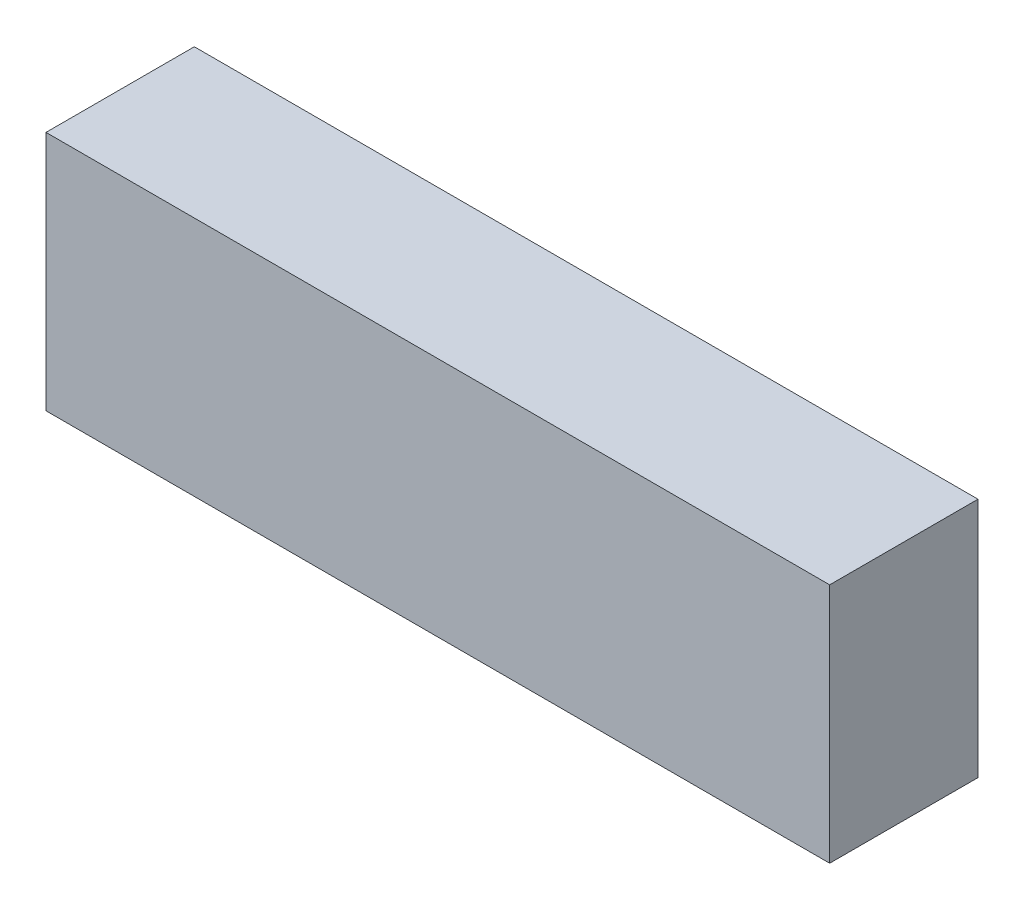
ISO-10303-21;
HEADER;
FILE_DESCRIPTION(('STEP AP214'),'2;1');
FILE_NAME('part.step','',(''),(''),'','','');
FILE_SCHEMA(('AUTOMOTIVE_DESIGN { 1 0 10303 214 1 1 1 1 }'));
ENDSEC;
DATA;
#1=APPLICATION_CONTEXT('core data for automotive mechanical design processes');
#2=APPLICATION_PROTOCOL_DEFINITION('international standard','automotive_design',2000,#1);
#3=PRODUCT_CONTEXT('',#1,'mechanical');
#4=PRODUCT('Part','Part','',(#3));
#5=PRODUCT_RELATED_PRODUCT_CATEGORY('part','',(#4));
#6=PRODUCT_DEFINITION_FORMATION('','',#4);
#7=PRODUCT_DEFINITION_CONTEXT('part definition',#1,'design');
#8=PRODUCT_DEFINITION('design','',#6,#7);
#9=PRODUCT_DEFINITION_SHAPE('','',#8);
#10=(LENGTH_UNIT() NAMED_UNIT(*) SI_UNIT(.MILLI.,.METRE.));
#11=(NAMED_UNIT(*) PLANE_ANGLE_UNIT() SI_UNIT($,.RADIAN.));
#12=(NAMED_UNIT(*) SI_UNIT($,.STERADIAN.) SOLID_ANGLE_UNIT());
#13=UNCERTAINTY_MEASURE_WITH_UNIT(LENGTH_MEASURE(1.E-05),#10,'distance_accuracy_value','');
#14=(GEOMETRIC_REPRESENTATION_CONTEXT(3) GLOBAL_UNCERTAINTY_ASSIGNED_CONTEXT((#13)) GLOBAL_UNIT_ASSIGNED_CONTEXT((#10,
#11,#12)) REPRESENTATION_CONTEXT('',''));
#15=CARTESIAN_POINT('',(0.,0.,0.));
#16=DIRECTION('',(0.,0.,1.));
#17=DIRECTION('',(1.,0.,0.));
#18=AXIS2_PLACEMENT_3D('',#15,#16,#17);
#19=CARTESIAN_POINT('',(-2.6416,-0.762,1.));
#20=DIRECTION('',(1.,0.,0.));
#21=DIRECTION('',(0.,0.,-1.));
#22=AXIS2_PLACEMENT_3D('',#19,#20,#21);
#23=PLANE('',#22);
#24=DIRECTION('',(0.,-1.,0.));
#25=VECTOR('',#24,1.);
#26=CARTESIAN_POINT('',(-2.6416,-0.762,0.));
#27=LINE('',#26,#25);
#28=CARTESIAN_POINT('',(-2.6416,0.8636,0.));
#29=VERTEX_POINT('',#28);
#30=CARTESIAN_POINT('',(-2.6416,-0.762,0.));
#31=VERTEX_POINT('',#30);
#32=EDGE_CURVE('E95',#29,#31,#27,.T.);
#33=ORIENTED_EDGE('',*,*,#32,.T.);
#34=DIRECTION('',(0.,0.,-1.));
#35=VECTOR('',#34,1.);
#36=CARTESIAN_POINT('',(-2.6416,-0.762,1.));
#37=LINE('',#36,#35);
#38=CARTESIAN_POINT('',(-2.6416,-0.762,1.));
#39=VERTEX_POINT('',#38);
#40=EDGE_CURVE('E11',#39,#31,#37,.T.);
#41=ORIENTED_EDGE('',*,*,#40,.F.);
#42=DIRECTION('',(0.,-1.,0.));
#43=VECTOR('',#42,1.);
#44=CARTESIAN_POINT('',(-2.6416,-0.762,1.));
#45=LINE('',#44,#43);
#46=CARTESIAN_POINT('',(-2.6416,0.8636,1.));
#47=VERTEX_POINT('',#46);
#48=EDGE_CURVE('E83',#47,#39,#45,.T.);
#49=ORIENTED_EDGE('',*,*,#48,.F.);
#50=DIRECTION('',(0.,0.,-1.));
#51=VECTOR('',#50,1.);
#52=CARTESIAN_POINT('',(-2.6416,0.8636,1.));
#53=LINE('',#52,#51);
#54=EDGE_CURVE('E91',#47,#29,#53,.T.);
#55=ORIENTED_EDGE('',*,*,#54,.T.);
#56=EDGE_LOOP('',(#33,#41,#49,#55));
#57=FACE_BOUND('',#56,.T.);
#58=ADVANCED_FACE('F32',(#57),#23,.F.);
#59=CARTESIAN_POINT('',(2.6416,-0.762,1.));
#60=DIRECTION('',(0.,1.,0.));
#61=DIRECTION('',(0.,0.,1.));
#62=AXIS2_PLACEMENT_3D('',#59,#60,#61);
#63=PLANE('',#62);
#64=DIRECTION('',(1.,0.,0.));
#65=VECTOR('',#64,1.);
#66=CARTESIAN_POINT('',(2.6416,-0.762,0.));
#67=LINE('',#66,#65);
#68=CARTESIAN_POINT('',(2.6416,-0.762,0.));
#69=VERTEX_POINT('',#68);
#70=EDGE_CURVE('E87',#31,#69,#67,.T.);
#71=ORIENTED_EDGE('',*,*,#70,.T.);
#72=DIRECTION('',(0.,0.,-1.));
#73=VECTOR('',#72,1.);
#74=CARTESIAN_POINT('',(2.6416,-0.762,1.));
#75=LINE('',#74,#73);
#76=CARTESIAN_POINT('',(2.6416,-0.762,1.));
#77=VERTEX_POINT('',#76);
#78=EDGE_CURVE('E40',#77,#69,#75,.T.);
#79=ORIENTED_EDGE('',*,*,#78,.F.);
#80=DIRECTION('',(1.,0.,0.));
#81=VECTOR('',#80,1.);
#82=CARTESIAN_POINT('',(2.6416,-0.762,1.));
#83=LINE('',#82,#81);
#84=EDGE_CURVE('E78',#39,#77,#83,.T.);
#85=ORIENTED_EDGE('',*,*,#84,.F.);
#86=ORIENTED_EDGE('',*,*,#40,.T.);
#87=EDGE_LOOP('',(#71,#79,#85,#86));
#88=FACE_BOUND('',#87,.T.);
#89=ADVANCED_FACE('F86',(#88),#63,.F.);
#90=CARTESIAN_POINT('',(2.6416,0.8636,1.));
#91=DIRECTION('',(-1.,0.,0.));
#92=DIRECTION('',(0.,0.,1.));
#93=AXIS2_PLACEMENT_3D('',#90,#91,#92);
#94=PLANE('',#93);
#95=DIRECTION('',(0.,1.,0.));
#96=VECTOR('',#95,1.);
#97=CARTESIAN_POINT('',(2.6416,0.8636,0.));
#98=LINE('',#97,#96);
#99=CARTESIAN_POINT('',(2.6416,0.8636,0.));
#100=VERTEX_POINT('',#99);
#101=EDGE_CURVE('E65',#69,#100,#98,.T.);
#102=ORIENTED_EDGE('',*,*,#101,.T.);
#103=DIRECTION('',(0.,0.,-1.));
#104=VECTOR('',#103,1.);
#105=CARTESIAN_POINT('',(2.6416,0.8636,1.));
#106=LINE('',#105,#104);
#107=CARTESIAN_POINT('',(2.6416,0.8636,1.));
#108=VERTEX_POINT('',#107);
#109=EDGE_CURVE('E88',#108,#100,#106,.T.);
#110=ORIENTED_EDGE('',*,*,#109,.F.);
#111=DIRECTION('',(0.,1.,0.));
#112=VECTOR('',#111,1.);
#113=CARTESIAN_POINT('',(2.6416,0.8636,1.));
#114=LINE('',#113,#112);
#115=EDGE_CURVE('E81',#77,#108,#114,.T.);
#116=ORIENTED_EDGE('',*,*,#115,.F.);
#117=ORIENTED_EDGE('',*,*,#78,.T.);
#118=EDGE_LOOP('',(#102,#110,#116,#117));
#119=FACE_BOUND('',#118,.T.);
#120=ADVANCED_FACE('F89',(#119),#94,.F.);
#121=CARTESIAN_POINT('',(-2.6416,0.8636,1.));
#122=DIRECTION('',(0.,-1.,0.));
#123=DIRECTION('',(0.,0.,-1.));
#124=AXIS2_PLACEMENT_3D('',#121,#122,#123);
#125=PLANE('',#124);
#126=DIRECTION('',(-1.,0.,0.));
#127=VECTOR('',#126,1.);
#128=CARTESIAN_POINT('',(-2.6416,0.8636,0.));
#129=LINE('',#128,#127);
#130=EDGE_CURVE('E71',#100,#29,#129,.T.);
#131=ORIENTED_EDGE('',*,*,#130,.T.);
#132=ORIENTED_EDGE('',*,*,#54,.F.);
#133=DIRECTION('',(-1.,0.,0.));
#134=VECTOR('',#133,1.);
#135=CARTESIAN_POINT('',(-2.6416,0.8636,1.));
#136=LINE('',#135,#134);
#137=EDGE_CURVE('E48',#108,#47,#136,.T.);
#138=ORIENTED_EDGE('',*,*,#137,.F.);
#139=ORIENTED_EDGE('',*,*,#109,.T.);
#140=EDGE_LOOP('',(#131,#132,#138,#139));
#141=FACE_BOUND('',#140,.T.);
#142=ADVANCED_FACE('F102',(#141),#125,.F.);
#143=CARTESIAN_POINT('',(0.,0.,1.));
#144=DIRECTION('',(0.,0.,-1.));
#145=DIRECTION('',(-1.,0.,0.));
#146=AXIS2_PLACEMENT_3D('',#143,#144,#145);
#147=PLANE('',#146);
#148=ORIENTED_EDGE('',*,*,#48,.T.);
#149=ORIENTED_EDGE('',*,*,#84,.T.);
#150=ORIENTED_EDGE('',*,*,#115,.T.);
#151=ORIENTED_EDGE('',*,*,#137,.T.);
#152=EDGE_LOOP('',(#148,#149,#150,#151));
#153=FACE_BOUND('',#152,.T.);
#154=ADVANCED_FACE('F79',(#153),#147,.F.);
#155=CARTESIAN_POINT('',(0.,0.,0.));
#156=DIRECTION('',(0.,0.,-1.));
#157=DIRECTION('',(-1.,0.,0.));
#158=AXIS2_PLACEMENT_3D('',#155,#156,#157);
#159=PLANE('',#158);
#160=ORIENTED_EDGE('',*,*,#32,.F.);
#161=ORIENTED_EDGE('',*,*,#130,.F.);
#162=ORIENTED_EDGE('',*,*,#101,.F.);
#163=ORIENTED_EDGE('',*,*,#70,.F.);
#164=EDGE_LOOP('',(#160,#161,#162,#163));
#165=FACE_BOUND('',#164,.T.);
#166=ADVANCED_FACE('F105',(#165),#159,.T.);
#167=CLOSED_SHELL('',(#58,#89,#120,#142,#154,#166));
#168=MANIFOLD_SOLID_BREP('B2',#167);
#169=ADVANCED_BREP_SHAPE_REPRESENTATION('',(#18,#168),#14);
#170=SHAPE_DEFINITION_REPRESENTATION(#9,#169);
ENDSEC;
END-ISO-10303-21;
